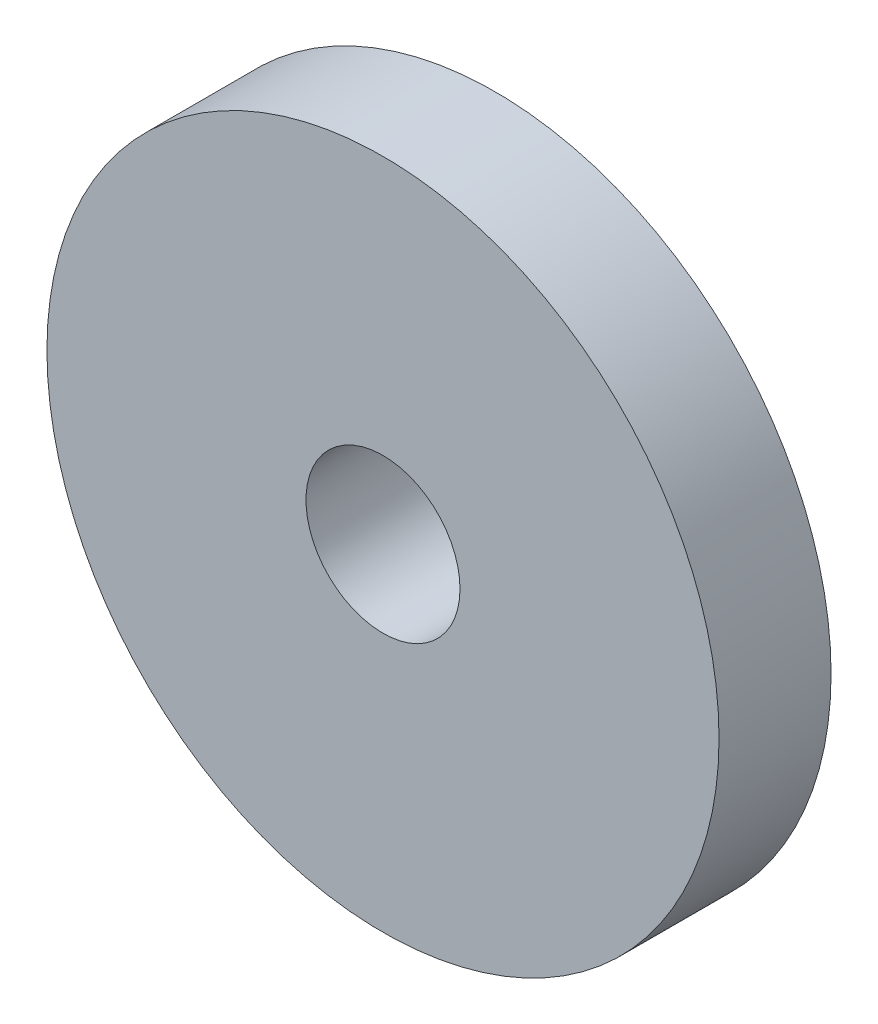
ISO-10303-21;
HEADER;
FILE_DESCRIPTION(('STEP AP214'),'2;1');
FILE_NAME('part.step','',(''),(''),'','','');
FILE_SCHEMA(('AUTOMOTIVE_DESIGN { 1 0 10303 214 1 1 1 1 }'));
ENDSEC;
DATA;
#1=APPLICATION_CONTEXT('core data for automotive mechanical design processes');
#2=APPLICATION_PROTOCOL_DEFINITION('international standard','automotive_design',2000,#1);
#3=PRODUCT_CONTEXT('',#1,'mechanical');
#4=PRODUCT('Part','Part','',(#3));
#5=PRODUCT_RELATED_PRODUCT_CATEGORY('part','',(#4));
#6=PRODUCT_DEFINITION_FORMATION('','',#4);
#7=PRODUCT_DEFINITION_CONTEXT('part definition',#1,'design');
#8=PRODUCT_DEFINITION('design','',#6,#7);
#9=PRODUCT_DEFINITION_SHAPE('','',#8);
#10=(LENGTH_UNIT() NAMED_UNIT(*) SI_UNIT(.MILLI.,.METRE.));
#11=(NAMED_UNIT(*) PLANE_ANGLE_UNIT() SI_UNIT($,.RADIAN.));
#12=(NAMED_UNIT(*) SI_UNIT($,.STERADIAN.) SOLID_ANGLE_UNIT());
#13=UNCERTAINTY_MEASURE_WITH_UNIT(LENGTH_MEASURE(1.E-05),#10,'distance_accuracy_value','');
#14=(GEOMETRIC_REPRESENTATION_CONTEXT(3) GLOBAL_UNCERTAINTY_ASSIGNED_CONTEXT((#13)) GLOBAL_UNIT_ASSIGNED_CONTEXT((#10,
#11,#12)) REPRESENTATION_CONTEXT('',''));
#15=CARTESIAN_POINT('',(0.,0.,0.));
#16=DIRECTION('',(0.,0.,1.));
#17=DIRECTION('',(1.,0.,0.));
#18=AXIS2_PLACEMENT_3D('',#15,#16,#17);
#19=CARTESIAN_POINT('',(0.,0.,2.));
#20=DIRECTION('',(0.,0.,1.));
#21=DIRECTION('',(1.,0.,0.));
#22=AXIS2_PLACEMENT_3D('',#19,#20,#21);
#23=PLANE('',#22);
#24=CARTESIAN_POINT('',(0.,0.,2.));
#25=DIRECTION('',(0.,0.,1.));
#26=DIRECTION('',(1.,0.,0.));
#27=AXIS2_PLACEMENT_3D('',#24,#25,#26);
#28=CIRCLE('',#27,6.);
#29=CARTESIAN_POINT('',(6.,0.,2.));
#30=VERTEX_POINT('',#29);
#31=EDGE_CURVE('E10',#30,#30,#28,.T.);
#32=ORIENTED_EDGE('',*,*,#31,.T.);
#33=EDGE_LOOP('',(#32));
#34=FACE_BOUND('',#33,.T.);
#35=CARTESIAN_POINT('',(0.,0.,2.));
#36=DIRECTION('',(0.,0.,1.));
#37=DIRECTION('',(1.,0.,0.));
#38=AXIS2_PLACEMENT_3D('',#35,#36,#37);
#39=CIRCLE('',#38,1.375);
#40=CARTESIAN_POINT('',(1.375,0.,2.));
#41=VERTEX_POINT('',#40);
#42=EDGE_CURVE('E43',#41,#41,#39,.T.);
#43=ORIENTED_EDGE('',*,*,#42,.F.);
#44=EDGE_LOOP('',(#43));
#45=FACE_BOUND('',#44,.T.);
#46=ADVANCED_FACE('F32',(#34,#45),#23,.T.);
#47=CARTESIAN_POINT('',(0.,0.,0.));
#48=DIRECTION('',(0.,0.,1.));
#49=DIRECTION('',(1.,0.,0.));
#50=AXIS2_PLACEMENT_3D('',#47,#48,#49);
#51=PLANE('',#50);
#52=CARTESIAN_POINT('',(0.,0.,0.));
#53=DIRECTION('',(0.,0.,1.));
#54=DIRECTION('',(1.,0.,0.));
#55=AXIS2_PLACEMENT_3D('',#52,#53,#54);
#56=CIRCLE('',#55,6.);
#57=CARTESIAN_POINT('',(6.,0.,0.));
#58=VERTEX_POINT('',#57);
#59=EDGE_CURVE('E36',#58,#58,#56,.T.);
#60=ORIENTED_EDGE('',*,*,#59,.F.);
#61=EDGE_LOOP('',(#60));
#62=FACE_BOUND('',#61,.T.);
#63=CARTESIAN_POINT('',(0.,0.,0.));
#64=DIRECTION('',(0.,0.,1.));
#65=DIRECTION('',(1.,0.,0.));
#66=AXIS2_PLACEMENT_3D('',#63,#64,#65);
#67=CIRCLE('',#66,1.375);
#68=CARTESIAN_POINT('',(1.375,0.,0.));
#69=VERTEX_POINT('',#68);
#70=EDGE_CURVE('E45',#69,#69,#67,.T.);
#71=ORIENTED_EDGE('',*,*,#70,.T.);
#72=EDGE_LOOP('',(#71));
#73=FACE_BOUND('',#72,.T.);
#74=ADVANCED_FACE('F55',(#62,#73),#51,.F.);
#75=CARTESIAN_POINT('',(0.,0.,2.));
#76=DIRECTION('',(0.,0.,-1.));
#77=DIRECTION('',(-1.,0.,0.));
#78=AXIS2_PLACEMENT_3D('',#75,#76,#77);
#79=CYLINDRICAL_SURFACE('',#78,6.);
#80=ORIENTED_EDGE('',*,*,#31,.F.);
#81=EDGE_LOOP('',(#80));
#82=FACE_BOUND('',#81,.T.);
#83=ORIENTED_EDGE('',*,*,#59,.T.);
#84=EDGE_LOOP('',(#83));
#85=FACE_BOUND('',#84,.T.);
#86=ADVANCED_FACE('F34',(#82,#85),#79,.T.);
#87=CARTESIAN_POINT('',(0.,0.,2.));
#88=DIRECTION('',(0.,0.,-1.));
#89=DIRECTION('',(-1.,0.,0.));
#90=AXIS2_PLACEMENT_3D('',#87,#88,#89);
#91=CYLINDRICAL_SURFACE('',#90,1.375);
#92=ORIENTED_EDGE('',*,*,#42,.T.);
#93=EDGE_LOOP('',(#92));
#94=FACE_BOUND('',#93,.T.);
#95=ORIENTED_EDGE('',*,*,#70,.F.);
#96=EDGE_LOOP('',(#95));
#97=FACE_BOUND('',#96,.T.);
#98=ADVANCED_FACE('F51',(#94,#97),#91,.F.);
#99=CLOSED_SHELL('',(#46,#74,#86,#98));
#100=MANIFOLD_SOLID_BREP('B2',#99);
#101=ADVANCED_BREP_SHAPE_REPRESENTATION('',(#18,#100),#14);
#102=SHAPE_DEFINITION_REPRESENTATION(#9,#101);
ENDSEC;
END-ISO-10303-21;
